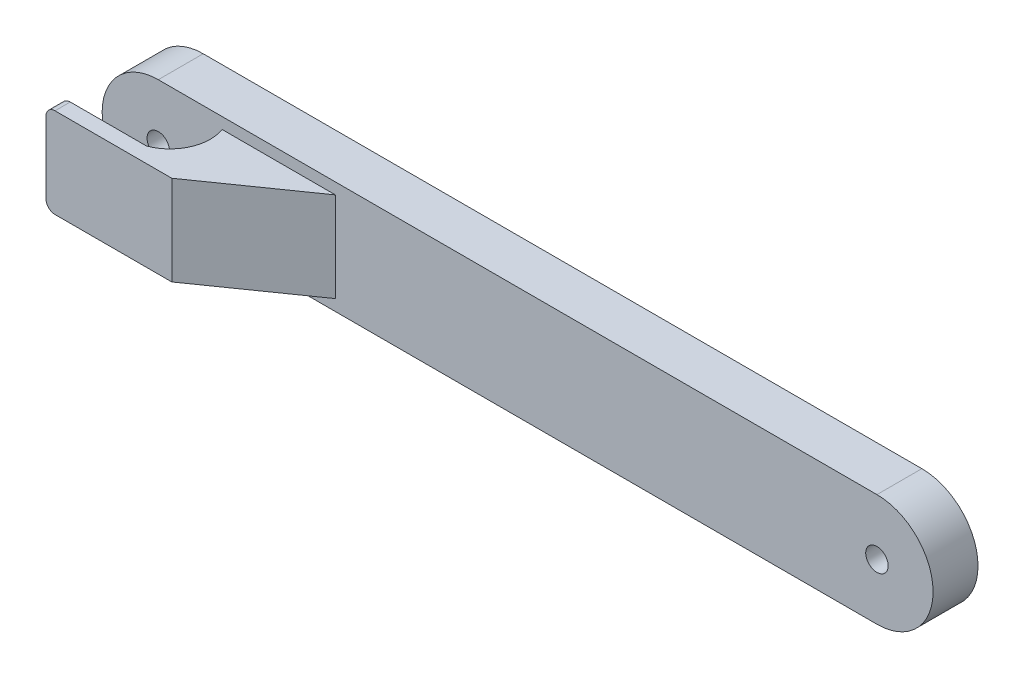
ISO-10303-21;
HEADER;
FILE_DESCRIPTION(('STEP AP214'),'2;1');
FILE_NAME('part.step','',(''),(''),'','','');
FILE_SCHEMA(('AUTOMOTIVE_DESIGN { 1 0 10303 214 1 1 1 1 }'));
ENDSEC;
DATA;
#1=APPLICATION_CONTEXT('core data for automotive mechanical design processes');
#2=APPLICATION_PROTOCOL_DEFINITION('international standard','automotive_design',2000,#1);
#3=PRODUCT_CONTEXT('',#1,'mechanical');
#4=PRODUCT('Part','Part','',(#3));
#5=PRODUCT_RELATED_PRODUCT_CATEGORY('part','',(#4));
#6=PRODUCT_DEFINITION_FORMATION('','',#4);
#7=PRODUCT_DEFINITION_CONTEXT('part definition',#1,'design');
#8=PRODUCT_DEFINITION('design','',#6,#7);
#9=PRODUCT_DEFINITION_SHAPE('','',#8);
#10=(LENGTH_UNIT() NAMED_UNIT(*) SI_UNIT(.MILLI.,.METRE.));
#11=(NAMED_UNIT(*) PLANE_ANGLE_UNIT() SI_UNIT($,.RADIAN.));
#12=(NAMED_UNIT(*) SI_UNIT($,.STERADIAN.) SOLID_ANGLE_UNIT());
#13=UNCERTAINTY_MEASURE_WITH_UNIT(LENGTH_MEASURE(1.E-05),#10,'distance_accuracy_value','');
#14=(GEOMETRIC_REPRESENTATION_CONTEXT(3) GLOBAL_UNCERTAINTY_ASSIGNED_CONTEXT((#13)) GLOBAL_UNIT_ASSIGNED_CONTEXT((#10,
#11,#12)) REPRESENTATION_CONTEXT('',''));
#15=CARTESIAN_POINT('',(0.,0.,0.));
#16=DIRECTION('',(0.,0.,1.));
#17=DIRECTION('',(1.,0.,0.));
#18=AXIS2_PLACEMENT_3D('',#15,#16,#17);
#19=CARTESIAN_POINT('',(299.870251740866,-79.0606144476608,6.35));
#20=DIRECTION('',(0.,0.,1.));
#21=DIRECTION('',(1.,0.,0.));
#22=AXIS2_PLACEMENT_3D('',#19,#20,#21);
#23=PLANE('',#22);
#24=CARTESIAN_POINT('',(503.070251740866,-79.0606144476608,6.35));
#25=DIRECTION('',(0.,0.,1.));
#26=DIRECTION('',(1.,0.,0.));
#27=AXIS2_PLACEMENT_3D('',#24,#25,#26);
#28=CIRCLE('',#27,3.17500000000008);
#29=CARTESIAN_POINT('',(506.245251740866,-79.0606144476608,6.35));
#30=VERTEX_POINT('',#29);
#31=EDGE_CURVE('E12',#30,#30,#28,.F.);
#32=ORIENTED_EDGE('',*,*,#31,.F.);
#33=EDGE_LOOP('',(#32));
#34=FACE_BOUND('',#33,.T.);
#35=CARTESIAN_POINT('',(299.870251740866,-79.0606144476608,6.35));
#36=DIRECTION('',(0.,0.,1.));
#37=DIRECTION('',(1.,0.,0.));
#38=AXIS2_PLACEMENT_3D('',#35,#36,#37);
#39=CIRCLE('',#38,3.17499999999997);
#40=CARTESIAN_POINT('',(303.045251740866,-79.0606144476608,6.35));
#41=VERTEX_POINT('',#40);
#42=EDGE_CURVE('E64',#41,#41,#39,.F.);
#43=ORIENTED_EDGE('',*,*,#42,.F.);
#44=EDGE_LOOP('',(#43));
#45=FACE_BOUND('',#44,.T.);
#46=CARTESIAN_POINT('',(503.070251740866,-79.0606144476608,6.35));
#47=DIRECTION('',(0.,0.,1.));
#48=DIRECTION('',(1.,0.,0.));
#49=AXIS2_PLACEMENT_3D('',#46,#47,#48);
#50=CIRCLE('',#49,15.875);
#51=CARTESIAN_POINT('',(503.070251740866,-63.1856144476608,6.35));
#52=VERTEX_POINT('',#51);
#53=CARTESIAN_POINT('',(503.070251740866,-94.9356144476608,6.35));
#54=VERTEX_POINT('',#53);
#55=EDGE_CURVE('E72',#52,#54,#50,.F.);
#56=ORIENTED_EDGE('',*,*,#55,.T.);
#57=DIRECTION('',(-1.,0.,0.));
#58=VECTOR('',#57,1.);
#59=CARTESIAN_POINT('',(299.870251740866,-94.9356144476608,6.35));
#60=LINE('',#59,#58);
#61=CARTESIAN_POINT('',(299.870251740866,-94.9356144476608,6.35));
#62=VERTEX_POINT('',#61);
#63=EDGE_CURVE('E84',#54,#62,#60,.T.);
#64=ORIENTED_EDGE('',*,*,#63,.T.);
#65=CARTESIAN_POINT('',(299.870251740866,-79.0606144476608,6.35));
#66=DIRECTION('',(0.,0.,1.));
#67=DIRECTION('',(1.,0.,0.));
#68=AXIS2_PLACEMENT_3D('',#65,#66,#67);
#69=CIRCLE('',#68,15.875);
#70=CARTESIAN_POINT('',(299.870251740866,-63.1856144476608,6.35));
#71=VERTEX_POINT('',#70);
#72=EDGE_CURVE('E83',#62,#71,#69,.F.);
#73=ORIENTED_EDGE('',*,*,#72,.T.);
#74=DIRECTION('',(1.,0.,0.));
#75=VECTOR('',#74,1.);
#76=CARTESIAN_POINT('',(299.870251740866,-63.1856144476608,6.35));
#77=LINE('',#76,#75);
#78=EDGE_CURVE('E77',#71,#52,#77,.T.);
#79=ORIENTED_EDGE('',*,*,#78,.T.);
#80=EDGE_LOOP('',(#56,#64,#73,#79));
#81=FACE_BOUND('',#80,.T.);
#82=ADVANCED_FACE('F56',(#34,#45,#81),#23,.F.);
#83=OPEN_SHELL('',(#82));
#84=SHELL_BASED_SURFACE_MODEL('B2',(#83));
#85=CARTESIAN_POINT('',(287.170251740866,-89.2206144476608,31.75));
#86=DIRECTION('',(1.,0.,0.));
#87=DIRECTION('',(0.,0.,-1.));
#88=AXIS2_PLACEMENT_3D('',#85,#86,#87);
#89=PLANE('',#88);
#90=DIRECTION('',(0.,1.,0.));
#91=VECTOR('',#90,1.);
#92=CARTESIAN_POINT('',(287.170251740866,-107.508614447661,27.432));
#93=LINE('',#92,#91);
#94=CARTESIAN_POINT('',(287.170251740866,-89.2206144476609,27.432));
#95=VERTEX_POINT('',#94);
#96=CARTESIAN_POINT('',(287.170251740866,-68.9006144476609,27.432));
#97=VERTEX_POINT('',#96);
#98=EDGE_CURVE('E134',#95,#97,#93,.T.);
#99=ORIENTED_EDGE('',*,*,#98,.F.);
#100=DIRECTION('',(0.,0.,-1.));
#101=VECTOR('',#100,1.);
#102=CARTESIAN_POINT('',(287.170251740866,-89.2206144476608,31.75));
#103=LINE('',#102,#101);
#104=CARTESIAN_POINT('',(287.170251740866,-89.2206144476608,31.75));
#105=VERTEX_POINT('',#104);
#106=EDGE_CURVE('E263',#105,#95,#103,.T.);
#107=ORIENTED_EDGE('',*,*,#106,.F.);
#108=DIRECTION('',(0.,-1.,0.));
#109=VECTOR('',#108,1.);
#110=CARTESIAN_POINT('',(287.170251740866,-89.2206144476608,31.75));
#111=LINE('',#110,#109);
#112=CARTESIAN_POINT('',(287.170251740866,-68.9006144476609,31.75));
#113=VERTEX_POINT('',#112);
#114=EDGE_CURVE('E247',#113,#105,#111,.T.);
#115=ORIENTED_EDGE('',*,*,#114,.F.);
#116=DIRECTION('',(0.,0.,-1.));
#117=VECTOR('',#116,1.);
#118=CARTESIAN_POINT('',(287.170251740866,-68.9006144476609,31.75));
#119=LINE('',#118,#117);
#120=EDGE_CURVE('E270',#113,#97,#119,.T.);
#121=ORIENTED_EDGE('',*,*,#120,.T.);
#122=EDGE_LOOP('',(#99,#107,#115,#121));
#123=FACE_BOUND('',#122,.T.);
#124=ADVANCED_FACE('F117',(#123),#89,.F.);
#125=CARTESIAN_POINT('',(289.710251740866,-66.3606144476609,31.75));
#126=DIRECTION('',(0.,-1.,0.));
#127=DIRECTION('',(0.,0.,-1.));
#128=AXIS2_PLACEMENT_3D('',#125,#126,#127);
#129=PLANE('',#128);
#130=DIRECTION('',(1.,0.,0.));
#131=VECTOR('',#130,1.);
#132=CARTESIAN_POINT('',(287.170251740866,-66.3606144476609,27.432));
#133=LINE('',#132,#131);
#134=CARTESIAN_POINT('',(289.710251740866,-66.3606144476609,27.432));
#135=VERTEX_POINT('',#134);
#136=CARTESIAN_POINT('',(311.300251740866,-66.3606144476609,27.432));
#137=VERTEX_POINT('',#136);
#138=EDGE_CURVE('E130',#135,#137,#133,.T.);
#139=ORIENTED_EDGE('',*,*,#138,.F.);
#140=DIRECTION('',(0.,0.,-1.));
#141=VECTOR('',#140,1.);
#142=CARTESIAN_POINT('',(289.710251740866,-66.3606144476609,31.75));
#143=LINE('',#142,#141);
#144=CARTESIAN_POINT('',(289.710251740866,-66.3606144476609,31.75));
#145=VERTEX_POINT('',#144);
#146=EDGE_CURVE('E272',#145,#135,#143,.T.);
#147=ORIENTED_EDGE('',*,*,#146,.F.);
#148=DIRECTION('',(-1.,0.,0.));
#149=VECTOR('',#148,1.);
#150=CARTESIAN_POINT('',(312.570251740866,-66.3606144476609,31.75));
#151=LINE('',#150,#149);
#152=CARTESIAN_POINT('',(322.730251740866,-66.3606144476609,31.75));
#153=VERTEX_POINT('',#152);
#154=EDGE_CURVE('E258',#153,#145,#151,.T.);
#155=ORIENTED_EDGE('',*,*,#154,.F.);
#156=DIRECTION('',(0.819152044288995,0.,-0.573576436351041));
#157=VECTOR('',#156,1.);
#158=CARTESIAN_POINT('',(322.730251740866,-66.3606144476609,31.75));
#159=LINE('',#158,#157);
#160=CARTESIAN_POINT('',(349.936471269304,-66.3606144476609,12.7));
#161=VERTEX_POINT('',#160);
#162=EDGE_CURVE('E225',#153,#161,#159,.T.);
#163=ORIENTED_EDGE('',*,*,#162,.T.);
#164=DIRECTION('',(-1.,0.,0.));
#165=VECTOR('',#164,1.);
#166=CARTESIAN_POINT('',(289.710251740866,-66.3606144476609,12.7));
#167=LINE('',#166,#165);
#168=CARTESIAN_POINT('',(317.904251740866,-66.3606144476609,12.7));
#169=VERTEX_POINT('',#168);
#170=EDGE_CURVE('E255',#161,#169,#167,.T.);
#171=ORIENTED_EDGE('',*,*,#170,.T.);
#172=CARTESIAN_POINT('',(307.218041577106,-66.3606144476609,16.7558368231421));
#173=DIRECTION('',(0.,1.,0.));
#174=DIRECTION('',(0.,0.,-1.));
#175=AXIS2_PLACEMENT_3D('',#172,#173,#174);
#176=CIRCLE('',#175,11.43);
#177=EDGE_CURVE('E511',#137,#169,#176,.T.);
#178=ORIENTED_EDGE('',*,*,#177,.F.);
#179=EDGE_LOOP('',(#139,#147,#155,#163,#171,#178));
#180=FACE_BOUND('',#179,.T.);
#181=ADVANCED_FACE('F355',(#180),#129,.F.);
#182=CARTESIAN_POINT('',(299.870251740866,-79.0606144476608,12.7));
#183=DIRECTION('',(0.,0.,1.));
#184=DIRECTION('',(1.,0.,0.));
#185=AXIS2_PLACEMENT_3D('',#182,#183,#184);
#186=PLANE('',#185);
#187=ORIENTED_EDGE('',*,*,#170,.F.);
#188=DIRECTION('',(0.,1.,0.));
#189=VECTOR('',#188,1.);
#190=CARTESIAN_POINT('',(349.936471269304,-91.7606144476608,12.7));
#191=LINE('',#190,#189);
#192=CARTESIAN_POINT('',(349.936471269304,-91.7606144476608,12.7));
#193=VERTEX_POINT('',#192);
#194=EDGE_CURVE('E237',#193,#161,#191,.T.);
#195=ORIENTED_EDGE('',*,*,#194,.F.);
#196=DIRECTION('',(1.,0.,0.));
#197=VECTOR('',#196,1.);
#198=CARTESIAN_POINT('',(310.030251740866,-91.7606144476609,12.7));
#199=LINE('',#198,#197);
#200=CARTESIAN_POINT('',(317.904251740866,-91.7606144476609,12.7));
#201=VERTEX_POINT('',#200);
#202=EDGE_CURVE('E240',#201,#193,#199,.T.);
#203=ORIENTED_EDGE('',*,*,#202,.F.);
#204=DIRECTION('',(0.,1.,0.));
#205=VECTOR('',#204,1.);
#206=CARTESIAN_POINT('',(317.904251740866,-107.508614447661,12.7));
#207=LINE('',#206,#205);
#208=EDGE_CURVE('E520',#201,#169,#207,.T.);
#209=ORIENTED_EDGE('',*,*,#208,.T.);
#210=EDGE_LOOP('',(#187,#195,#203,#209));
#211=FACE_BOUND('',#210,.T.);
#212=CARTESIAN_POINT('',(299.870251740866,-79.0606144476608,12.7));
#213=DIRECTION('',(0.,0.,1.));
#214=DIRECTION('',(1.,0.,0.));
#215=AXIS2_PLACEMENT_3D('',#212,#213,#214);
#216=CIRCLE('',#215,15.875);
#217=CARTESIAN_POINT('',(299.870251740866,-63.1856144476608,12.7));
#218=VERTEX_POINT('',#217);
#219=CARTESIAN_POINT('',(299.870251740866,-94.9356144476608,12.7));
#220=VERTEX_POINT('',#219);
#221=EDGE_CURVE('E166',#218,#220,#216,.T.);
#222=ORIENTED_EDGE('',*,*,#221,.T.);
#223=DIRECTION('',(1.,0.,0.));
#224=VECTOR('',#223,1.);
#225=CARTESIAN_POINT('',(299.870251740866,-94.9356144476608,12.7));
#226=LINE('',#225,#224);
#227=CARTESIAN_POINT('',(503.070251740866,-94.9356144476608,12.7));
#228=VERTEX_POINT('',#227);
#229=EDGE_CURVE('E295',#220,#228,#226,.T.);
#230=ORIENTED_EDGE('',*,*,#229,.T.);
#231=CARTESIAN_POINT('',(503.070251740866,-79.0606144476608,12.7));
#232=DIRECTION('',(0.,0.,1.));
#233=DIRECTION('',(1.,0.,0.));
#234=AXIS2_PLACEMENT_3D('',#231,#232,#233);
#235=CIRCLE('',#234,15.875);
#236=CARTESIAN_POINT('',(503.070251740866,-63.1856144476608,12.7));
#237=VERTEX_POINT('',#236);
#238=EDGE_CURVE('E300',#228,#237,#235,.T.);
#239=ORIENTED_EDGE('',*,*,#238,.T.);
#240=DIRECTION('',(-1.,0.,0.));
#241=VECTOR('',#240,1.);
#242=CARTESIAN_POINT('',(299.870251740866,-63.1856144476608,12.7));
#243=LINE('',#242,#241);
#244=EDGE_CURVE('E145',#237,#218,#243,.T.);
#245=ORIENTED_EDGE('',*,*,#244,.T.);
#246=EDGE_LOOP('',(#222,#230,#239,#245));
#247=FACE_BOUND('',#246,.T.);
#248=CARTESIAN_POINT('',(503.070251740866,-79.0606144476608,12.7));
#249=DIRECTION('',(0.,0.,1.));
#250=DIRECTION('',(1.,0.,0.));
#251=AXIS2_PLACEMENT_3D('',#248,#249,#250);
#252=CIRCLE('',#251,3.17500000000008);
#253=CARTESIAN_POINT('',(506.245251740866,-79.0606144476608,12.7));
#254=VERTEX_POINT('',#253);
#255=EDGE_CURVE('E278',#254,#254,#252,.T.);
#256=ORIENTED_EDGE('',*,*,#255,.F.);
#257=EDGE_LOOP('',(#256));
#258=FACE_BOUND('',#257,.T.);
#259=CARTESIAN_POINT('',(299.870251740866,-79.0606144476608,12.7));
#260=DIRECTION('',(0.,0.,1.));
#261=DIRECTION('',(1.,0.,0.));
#262=AXIS2_PLACEMENT_3D('',#259,#260,#261);
#263=CIRCLE('',#262,3.17499999999997);
#264=CARTESIAN_POINT('',(303.045251740866,-79.0606144476608,12.7));
#265=VERTEX_POINT('',#264);
#266=EDGE_CURVE('E260',#265,#265,#263,.T.);
#267=ORIENTED_EDGE('',*,*,#266,.F.);
#268=EDGE_LOOP('',(#267));
#269=FACE_BOUND('',#268,.T.);
#270=ADVANCED_FACE('F359',(#211,#247,#258,#269),#186,.T.);
#271=CARTESIAN_POINT('',(299.870251740866,-79.0606144476608,0.));
#272=DIRECTION('',(0.,0.,1.));
#273=DIRECTION('',(1.,0.,0.));
#274=AXIS2_PLACEMENT_3D('',#271,#272,#273);
#275=PLANE('',#274);
#276=CARTESIAN_POINT('',(299.870251740866,-79.0606144476608,0.));
#277=DIRECTION('',(0.,0.,1.));
#278=DIRECTION('',(1.,0.,0.));
#279=AXIS2_PLACEMENT_3D('',#276,#277,#278);
#280=CIRCLE('',#279,15.875);
#281=CARTESIAN_POINT('',(299.870251740866,-63.1856144476608,0.));
#282=VERTEX_POINT('',#281);
#283=CARTESIAN_POINT('',(299.870251740866,-94.9356144476608,0.));
#284=VERTEX_POINT('',#283);
#285=EDGE_CURVE('E293',#282,#284,#280,.T.);
#286=ORIENTED_EDGE('',*,*,#285,.F.);
#287=DIRECTION('',(-1.,0.,0.));
#288=VECTOR('',#287,1.);
#289=CARTESIAN_POINT('',(299.870251740866,-63.1856144476608,0.));
#290=LINE('',#289,#288);
#291=CARTESIAN_POINT('',(503.070251740866,-63.1856144476608,0.));
#292=VERTEX_POINT('',#291);
#293=EDGE_CURVE('E161',#292,#282,#290,.T.);
#294=ORIENTED_EDGE('',*,*,#293,.F.);
#295=CARTESIAN_POINT('',(503.070251740866,-79.0606144476608,0.));
#296=DIRECTION('',(0.,0.,1.));
#297=DIRECTION('',(1.,0.,0.));
#298=AXIS2_PLACEMENT_3D('',#295,#296,#297);
#299=CIRCLE('',#298,15.875);
#300=CARTESIAN_POINT('',(503.070251740866,-94.9356144476608,0.));
#301=VERTEX_POINT('',#300);
#302=EDGE_CURVE('E307',#301,#292,#299,.T.);
#303=ORIENTED_EDGE('',*,*,#302,.F.);
#304=DIRECTION('',(1.,0.,0.));
#305=VECTOR('',#304,1.);
#306=CARTESIAN_POINT('',(299.870251740866,-94.9356144476608,0.));
#307=LINE('',#306,#305);
#308=EDGE_CURVE('E306',#284,#301,#307,.T.);
#309=ORIENTED_EDGE('',*,*,#308,.F.);
#310=EDGE_LOOP('',(#286,#294,#303,#309));
#311=FACE_BOUND('',#310,.T.);
#312=CARTESIAN_POINT('',(299.870251740866,-79.0606144476608,0.));
#313=DIRECTION('',(0.,0.,1.));
#314=DIRECTION('',(1.,0.,0.));
#315=AXIS2_PLACEMENT_3D('',#312,#313,#314);
#316=CIRCLE('',#315,3.17499999999997);
#317=CARTESIAN_POINT('',(303.045251740866,-79.0606144476608,0.));
#318=VERTEX_POINT('',#317);
#319=EDGE_CURVE('E277',#318,#318,#316,.T.);
#320=ORIENTED_EDGE('',*,*,#319,.T.);
#321=EDGE_LOOP('',(#320));
#322=FACE_BOUND('',#321,.T.);
#323=CARTESIAN_POINT('',(503.070251740866,-79.0606144476608,0.));
#324=DIRECTION('',(0.,0.,1.));
#325=DIRECTION('',(1.,0.,0.));
#326=AXIS2_PLACEMENT_3D('',#323,#324,#325);
#327=CIRCLE('',#326,3.17500000000008);
#328=CARTESIAN_POINT('',(506.245251740866,-79.0606144476608,0.));
#329=VERTEX_POINT('',#328);
#330=EDGE_CURVE('E273',#329,#329,#327,.T.);
#331=ORIENTED_EDGE('',*,*,#330,.T.);
#332=EDGE_LOOP('',(#331));
#333=FACE_BOUND('',#332,.T.);
#334=ADVANCED_FACE('F332',(#311,#322,#333),#275,.F.);
#335=CARTESIAN_POINT('',(299.870251740866,-79.0606144476608,12.7));
#336=DIRECTION('',(0.,0.,-1.));
#337=DIRECTION('',(-1.,0.,0.));
#338=AXIS2_PLACEMENT_3D('',#335,#336,#337);
#339=CYLINDRICAL_SURFACE('',#338,15.875);
#340=ORIENTED_EDGE('',*,*,#285,.T.);
#341=DIRECTION('',(0.,0.,-1.));
#342=VECTOR('',#341,1.);
#343=CARTESIAN_POINT('',(299.870251740866,-94.9356144476608,12.7));
#344=LINE('',#343,#342);
#345=EDGE_CURVE('E257',#220,#284,#344,.T.);
#346=ORIENTED_EDGE('',*,*,#345,.F.);
#347=ORIENTED_EDGE('',*,*,#221,.F.);
#348=DIRECTION('',(0.,0.,-1.));
#349=VECTOR('',#348,1.);
#350=CARTESIAN_POINT('',(299.870251740866,-63.1856144476608,12.7));
#351=LINE('',#350,#349);
#352=EDGE_CURVE('E305',#218,#282,#351,.T.);
#353=ORIENTED_EDGE('',*,*,#352,.T.);
#354=EDGE_LOOP('',(#340,#346,#347,#353));
#355=FACE_BOUND('',#354,.T.);
#356=ADVANCED_FACE('F119',(#355),#339,.T.);
#357=CARTESIAN_POINT('',(299.870251740866,-94.9356144476608,12.7));
#358=DIRECTION('',(0.,1.,0.));
#359=DIRECTION('',(0.,0.,1.));
#360=AXIS2_PLACEMENT_3D('',#357,#358,#359);
#361=PLANE('',#360);
#362=ORIENTED_EDGE('',*,*,#308,.T.);
#363=DIRECTION('',(0.,0.,-1.));
#364=VECTOR('',#363,1.);
#365=CARTESIAN_POINT('',(503.070251740866,-94.9356144476608,12.7));
#366=LINE('',#365,#364);
#367=EDGE_CURVE('E316',#228,#301,#366,.T.);
#368=ORIENTED_EDGE('',*,*,#367,.F.);
#369=ORIENTED_EDGE('',*,*,#229,.F.);
#370=ORIENTED_EDGE('',*,*,#345,.T.);
#371=EDGE_LOOP('',(#362,#368,#369,#370));
#372=FACE_BOUND('',#371,.T.);
#373=ADVANCED_FACE('F327',(#372),#361,.F.);
#374=CARTESIAN_POINT('',(503.070251740866,-79.0606144476608,12.7));
#375=DIRECTION('',(0.,0.,-1.));
#376=DIRECTION('',(-1.,0.,0.));
#377=AXIS2_PLACEMENT_3D('',#374,#375,#376);
#378=CYLINDRICAL_SURFACE('',#377,15.875);
#379=ORIENTED_EDGE('',*,*,#302,.T.);
#380=DIRECTION('',(0.,0.,-1.));
#381=VECTOR('',#380,1.);
#382=CARTESIAN_POINT('',(503.070251740866,-63.1856144476608,12.7));
#383=LINE('',#382,#381);
#384=EDGE_CURVE('E317',#237,#292,#383,.T.);
#385=ORIENTED_EDGE('',*,*,#384,.F.);
#386=ORIENTED_EDGE('',*,*,#238,.F.);
#387=ORIENTED_EDGE('',*,*,#367,.T.);
#388=EDGE_LOOP('',(#379,#385,#386,#387));
#389=FACE_BOUND('',#388,.T.);
#390=ADVANCED_FACE('F337',(#389),#378,.T.);
#391=CARTESIAN_POINT('',(299.870251740866,-63.1856144476608,12.7));
#392=DIRECTION('',(0.,-1.,0.));
#393=DIRECTION('',(0.,0.,-1.));
#394=AXIS2_PLACEMENT_3D('',#391,#392,#393);
#395=PLANE('',#394);
#396=ORIENTED_EDGE('',*,*,#293,.T.);
#397=ORIENTED_EDGE('',*,*,#352,.F.);
#398=ORIENTED_EDGE('',*,*,#244,.F.);
#399=ORIENTED_EDGE('',*,*,#384,.T.);
#400=EDGE_LOOP('',(#396,#397,#398,#399));
#401=FACE_BOUND('',#400,.T.);
#402=ADVANCED_FACE('F336',(#401),#395,.F.);
#403=CARTESIAN_POINT('',(299.870251740866,-79.0606144476608,12.7));
#404=DIRECTION('',(0.,0.,-1.));
#405=DIRECTION('',(-1.,0.,0.));
#406=AXIS2_PLACEMENT_3D('',#403,#404,#405);
#407=CYLINDRICAL_SURFACE('',#406,3.17499999999997);
#408=ORIENTED_EDGE('',*,*,#266,.T.);
#409=EDGE_LOOP('',(#408));
#410=FACE_BOUND('',#409,.T.);
#411=ORIENTED_EDGE('',*,*,#319,.F.);
#412=EDGE_LOOP('',(#411));
#413=FACE_BOUND('',#412,.T.);
#414=ADVANCED_FACE('F338',(#410,#413),#407,.F.);
#415=CARTESIAN_POINT('',(503.070251740866,-79.0606144476608,12.7));
#416=DIRECTION('',(0.,0.,-1.));
#417=DIRECTION('',(-1.,0.,0.));
#418=AXIS2_PLACEMENT_3D('',#415,#416,#417);
#419=CYLINDRICAL_SURFACE('',#418,3.17500000000008);
#420=ORIENTED_EDGE('',*,*,#255,.T.);
#421=EDGE_LOOP('',(#420));
#422=FACE_BOUND('',#421,.T.);
#423=ORIENTED_EDGE('',*,*,#330,.F.);
#424=EDGE_LOOP('',(#423));
#425=FACE_BOUND('',#424,.T.);
#426=ADVANCED_FACE('F347',(#422,#425),#419,.F.);
#427=CARTESIAN_POINT('',(289.710251740866,-89.2206144476609,31.75));
#428=DIRECTION('',(0.,0.,-1.));
#429=DIRECTION('',(-1.,0.,0.));
#430=AXIS2_PLACEMENT_3D('',#427,#428,#429);
#431=PLANE('',#430);
#432=ORIENTED_EDGE('',*,*,#154,.T.);
#433=CARTESIAN_POINT('',(289.710251740866,-68.9006144476609,31.75));
#434=DIRECTION('',(0.,0.,1.));
#435=DIRECTION('',(-1.,0.,0.));
#436=AXIS2_PLACEMENT_3D('',#433,#434,#435);
#437=CIRCLE('',#436,2.53999999999999);
#438=EDGE_CURVE('E542',#145,#113,#437,.T.);
#439=ORIENTED_EDGE('',*,*,#438,.T.);
#440=ORIENTED_EDGE('',*,*,#114,.T.);
#441=CARTESIAN_POINT('',(289.710251740866,-89.2206144476609,31.75));
#442=DIRECTION('',(0.,0.,1.));
#443=DIRECTION('',(-1.,0.,0.));
#444=AXIS2_PLACEMENT_3D('',#441,#442,#443);
#445=CIRCLE('',#444,2.53999999999999);
#446=CARTESIAN_POINT('',(289.710251740866,-91.7606144476608,31.75));
#447=VERTEX_POINT('',#446);
#448=EDGE_CURVE('E243',#105,#447,#445,.T.);
#449=ORIENTED_EDGE('',*,*,#448,.T.);
#450=DIRECTION('',(1.,0.,0.));
#451=VECTOR('',#450,1.);
#452=CARTESIAN_POINT('',(289.710251740866,-91.7606144476609,31.75));
#453=LINE('',#452,#451);
#454=CARTESIAN_POINT('',(322.730251740866,-91.7606144476608,31.75));
#455=VERTEX_POINT('',#454);
#456=EDGE_CURVE('E226',#447,#455,#453,.T.);
#457=ORIENTED_EDGE('',*,*,#456,.T.);
#458=DIRECTION('',(0.,1.,0.));
#459=VECTOR('',#458,1.);
#460=CARTESIAN_POINT('',(322.730251740866,-66.3606144476609,31.75));
#461=LINE('',#460,#459);
#462=EDGE_CURVE('E212',#455,#153,#461,.T.);
#463=ORIENTED_EDGE('',*,*,#462,.T.);
#464=EDGE_LOOP('',(#432,#439,#440,#449,#457,#463));
#465=FACE_BOUND('',#464,.T.);
#466=ADVANCED_FACE('F241',(#465),#431,.F.);
#467=CARTESIAN_POINT('',(310.030251740866,-91.7606144476609,31.75));
#468=DIRECTION('',(0.,1.,0.));
#469=DIRECTION('',(0.,0.,1.));
#470=AXIS2_PLACEMENT_3D('',#467,#468,#469);
#471=PLANE('',#470);
#472=DIRECTION('',(1.,0.,0.));
#473=VECTOR('',#472,1.);
#474=CARTESIAN_POINT('',(310.030251740866,-91.7606144476609,27.432));
#475=LINE('',#474,#473);
#476=CARTESIAN_POINT('',(289.710251740866,-91.7606144476608,27.432));
#477=VERTEX_POINT('',#476);
#478=CARTESIAN_POINT('',(311.300251740866,-91.7606144476609,27.432));
#479=VERTEX_POINT('',#478);
#480=EDGE_CURVE('E290',#477,#479,#475,.T.);
#481=ORIENTED_EDGE('',*,*,#480,.T.);
#482=CARTESIAN_POINT('',(307.218041577106,-91.7606144476609,16.7558368231421));
#483=DIRECTION('',(0.,1.,0.));
#484=DIRECTION('',(0.,0.,1.));
#485=AXIS2_PLACEMENT_3D('',#482,#483,#484);
#486=CIRCLE('',#485,11.43);
#487=EDGE_CURVE('E513',#479,#201,#486,.T.);
#488=ORIENTED_EDGE('',*,*,#487,.T.);
#489=ORIENTED_EDGE('',*,*,#202,.T.);
#490=DIRECTION('',(0.819152044288995,0.,-0.573576436351041));
#491=VECTOR('',#490,1.);
#492=CARTESIAN_POINT('',(322.730251740866,-91.7606144476608,31.75));
#493=LINE('',#492,#491);
#494=EDGE_CURVE('E219',#455,#193,#493,.T.);
#495=ORIENTED_EDGE('',*,*,#494,.F.);
#496=ORIENTED_EDGE('',*,*,#456,.F.);
#497=DIRECTION('',(0.,0.,-1.));
#498=VECTOR('',#497,1.);
#499=CARTESIAN_POINT('',(289.710251740866,-91.7606144476608,31.75));
#500=LINE('',#499,#498);
#501=EDGE_CURVE('E227',#447,#477,#500,.T.);
#502=ORIENTED_EDGE('',*,*,#501,.T.);
#503=EDGE_LOOP('',(#481,#488,#489,#495,#496,#502));
#504=FACE_BOUND('',#503,.T.);
#505=ADVANCED_FACE('F231',(#504),#471,.F.);
#506=CARTESIAN_POINT('',(289.710251740866,-89.2206144476609,31.75));
#507=DIRECTION('',(0.,0.,-1.));
#508=DIRECTION('',(-1.,0.,0.));
#509=AXIS2_PLACEMENT_3D('',#506,#507,#508);
#510=CYLINDRICAL_SURFACE('',#509,2.53999999999999);
#511=ORIENTED_EDGE('',*,*,#106,.T.);
#512=CARTESIAN_POINT('',(289.710251740866,-89.2206144476609,27.432));
#513=DIRECTION('',(0.,0.,1.));
#514=DIRECTION('',(1.,0.,0.));
#515=AXIS2_PLACEMENT_3D('',#512,#513,#514);
#516=CIRCLE('',#515,2.53999999999999);
#517=EDGE_CURVE('E531',#95,#477,#516,.T.);
#518=ORIENTED_EDGE('',*,*,#517,.T.);
#519=ORIENTED_EDGE('',*,*,#501,.F.);
#520=ORIENTED_EDGE('',*,*,#448,.F.);
#521=EDGE_LOOP('',(#511,#518,#519,#520));
#522=FACE_BOUND('',#521,.T.);
#523=ADVANCED_FACE('F362',(#522),#510,.T.);
#524=CARTESIAN_POINT('',(289.710251740866,-68.9006144476609,31.75));
#525=DIRECTION('',(0.,0.,-1.));
#526=DIRECTION('',(-1.,0.,0.));
#527=AXIS2_PLACEMENT_3D('',#524,#525,#526);
#528=CYLINDRICAL_SURFACE('',#527,2.53999999999999);
#529=ORIENTED_EDGE('',*,*,#146,.T.);
#530=CARTESIAN_POINT('',(289.710251740866,-68.9006144476609,27.432));
#531=DIRECTION('',(0.,0.,1.));
#532=DIRECTION('',(1.,0.,0.));
#533=AXIS2_PLACEMENT_3D('',#530,#531,#532);
#534=CIRCLE('',#533,2.53999999999999);
#535=EDGE_CURVE('E60',#135,#97,#534,.T.);
#536=ORIENTED_EDGE('',*,*,#535,.T.);
#537=ORIENTED_EDGE('',*,*,#120,.F.);
#538=ORIENTED_EDGE('',*,*,#438,.F.);
#539=EDGE_LOOP('',(#529,#536,#537,#538));
#540=FACE_BOUND('',#539,.T.);
#541=ADVANCED_FACE('F370',(#540),#528,.T.);
#542=CARTESIAN_POINT('',(287.170251740866,-107.508614447661,27.432));
#543=DIRECTION('',(0.,0.,1.));
#544=DIRECTION('',(1.,0.,0.));
#545=AXIS2_PLACEMENT_3D('',#542,#543,#544);
#546=PLANE('',#545);
#547=ORIENTED_EDGE('',*,*,#517,.F.);
#548=ORIENTED_EDGE('',*,*,#98,.T.);
#549=ORIENTED_EDGE('',*,*,#535,.F.);
#550=ORIENTED_EDGE('',*,*,#138,.T.);
#551=DIRECTION('',(0.,1.,0.));
#552=VECTOR('',#551,1.);
#553=CARTESIAN_POINT('',(311.300251740866,-107.508614447661,27.432));
#554=LINE('',#553,#552);
#555=EDGE_CURVE('E515',#479,#137,#554,.T.);
#556=ORIENTED_EDGE('',*,*,#555,.F.);
#557=ORIENTED_EDGE('',*,*,#480,.F.);
#558=EDGE_LOOP('',(#547,#548,#549,#550,#556,#557));
#559=FACE_BOUND('',#558,.T.);
#560=ADVANCED_FACE('F367',(#559),#546,.F.);
#561=CARTESIAN_POINT('',(307.218041577106,-107.508614447661,16.7558368231421));
#562=DIRECTION('',(0.,1.,0.));
#563=DIRECTION('',(0.,0.,1.));
#564=AXIS2_PLACEMENT_3D('',#561,#562,#563);
#565=CYLINDRICAL_SURFACE('',#564,11.43);
#566=ORIENTED_EDGE('',*,*,#555,.T.);
#567=ORIENTED_EDGE('',*,*,#177,.T.);
#568=ORIENTED_EDGE('',*,*,#208,.F.);
#569=ORIENTED_EDGE('',*,*,#487,.F.);
#570=EDGE_LOOP('',(#566,#567,#568,#569));
#571=FACE_BOUND('',#570,.T.);
#572=ADVANCED_FACE('F408',(#571),#565,.F.);
#573=CARTESIAN_POINT('',(322.730251740866,-91.7606144476608,31.75));
#574=DIRECTION('',(0.573576436351041,0.,0.819152044288995));
#575=DIRECTION('',(0.819152044288995,0.,-0.573576436351041));
#576=AXIS2_PLACEMENT_3D('',#573,#574,#575);
#577=PLANE('',#576);
#578=ORIENTED_EDGE('',*,*,#162,.F.);
#579=ORIENTED_EDGE('',*,*,#462,.F.);
#580=ORIENTED_EDGE('',*,*,#494,.T.);
#581=ORIENTED_EDGE('',*,*,#194,.T.);
#582=EDGE_LOOP('',(#578,#579,#580,#581));
#583=FACE_BOUND('',#582,.T.);
#584=ADVANCED_FACE('F220',(#583),#577,.T.);
#585=CLOSED_SHELL('',(#124,#181,#270,#334,#356,#373,#390,#402,#414,#426,#466,#505,#523,#541,
#560,#572,#584));
#586=MANIFOLD_SOLID_BREP('B6',#585);
#587=ADVANCED_BREP_SHAPE_REPRESENTATION('',(#18,#586),#14);
#588=MANIFOLD_SURFACE_SHAPE_REPRESENTATION('',(#18,#84),#14);
#589=SHAPE_REPRESENTATION('',(#18),#14);
#590=SHAPE_DEFINITION_REPRESENTATION(#9,#589);
#591=SHAPE_REPRESENTATION_RELATIONSHIP('','',#589,#587);
#592=SHAPE_REPRESENTATION_RELATIONSHIP('','',#589,#588);
ENDSEC;
END-ISO-10303-21;
